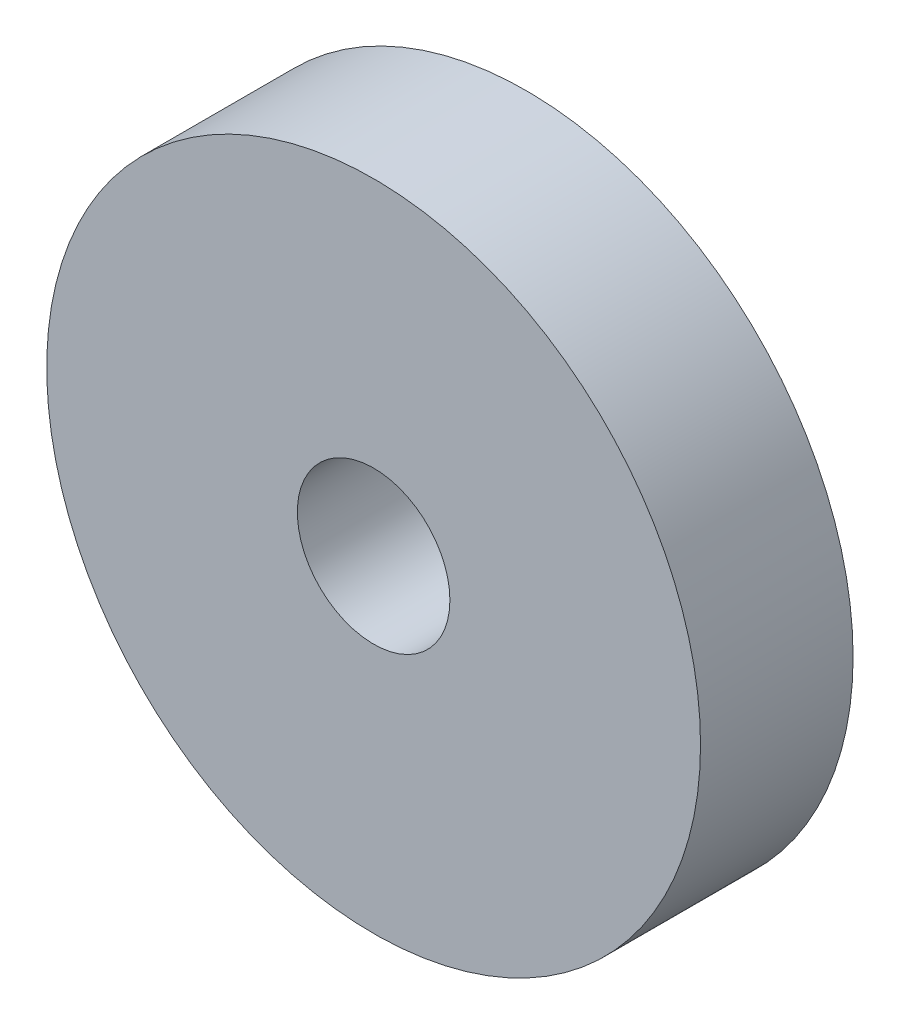
ISO-10303-21;
HEADER;
FILE_DESCRIPTION(('STEP AP214'),'2;1');
FILE_NAME('part.step','',(''),(''),'','','');
FILE_SCHEMA(('AUTOMOTIVE_DESIGN { 1 0 10303 214 1 1 1 1 }'));
ENDSEC;
DATA;
#1=APPLICATION_CONTEXT('core data for automotive mechanical design processes');
#2=APPLICATION_PROTOCOL_DEFINITION('international standard','automotive_design',2000,#1);
#3=PRODUCT_CONTEXT('',#1,'mechanical');
#4=PRODUCT('Part','Part','',(#3));
#5=PRODUCT_RELATED_PRODUCT_CATEGORY('part','',(#4));
#6=PRODUCT_DEFINITION_FORMATION('','',#4);
#7=PRODUCT_DEFINITION_CONTEXT('part definition',#1,'design');
#8=PRODUCT_DEFINITION('design','',#6,#7);
#9=PRODUCT_DEFINITION_SHAPE('','',#8);
#10=(LENGTH_UNIT() NAMED_UNIT(*) SI_UNIT(.MILLI.,.METRE.));
#11=(NAMED_UNIT(*) PLANE_ANGLE_UNIT() SI_UNIT($,.RADIAN.));
#12=(NAMED_UNIT(*) SI_UNIT($,.STERADIAN.) SOLID_ANGLE_UNIT());
#13=UNCERTAINTY_MEASURE_WITH_UNIT(LENGTH_MEASURE(1.E-05),#10,'distance_accuracy_value','');
#14=(GEOMETRIC_REPRESENTATION_CONTEXT(3) GLOBAL_UNCERTAINTY_ASSIGNED_CONTEXT((#13)) GLOBAL_UNIT_ASSIGNED_CONTEXT((#10,
#11,#12)) REPRESENTATION_CONTEXT('',''));
#15=CARTESIAN_POINT('',(0.,0.,0.));
#16=DIRECTION('',(0.,0.,1.));
#17=DIRECTION('',(1.,0.,0.));
#18=AXIS2_PLACEMENT_3D('',#15,#16,#17);
#19=CARTESIAN_POINT('',(0.,0.,1.778));
#20=DIRECTION('',(0.,0.,1.));
#21=DIRECTION('',(1.,0.,0.));
#22=AXIS2_PLACEMENT_3D('',#19,#20,#21);
#23=PLANE('',#22);
#24=CARTESIAN_POINT('',(0.,0.,1.778));
#25=DIRECTION('',(0.,0.,1.));
#26=DIRECTION('',(1.,0.,0.));
#27=AXIS2_PLACEMENT_3D('',#24,#25,#26);
#28=CIRCLE('',#27,3.81);
#29=CARTESIAN_POINT('',(3.81,0.,1.778));
#30=VERTEX_POINT('',#29);
#31=EDGE_CURVE('E10',#30,#30,#28,.T.);
#32=ORIENTED_EDGE('',*,*,#31,.T.);
#33=EDGE_LOOP('',(#32));
#34=FACE_BOUND('',#33,.T.);
#35=CARTESIAN_POINT('',(0.,0.,1.778));
#36=DIRECTION('',(0.,0.,1.));
#37=DIRECTION('',(1.,0.,0.));
#38=AXIS2_PLACEMENT_3D('',#35,#36,#37);
#39=CIRCLE('',#38,0.889000000000001);
#40=CARTESIAN_POINT('',(0.889000000000001,0.,1.778));
#41=VERTEX_POINT('',#40);
#42=EDGE_CURVE('E42',#41,#41,#39,.T.);
#43=ORIENTED_EDGE('',*,*,#42,.F.);
#44=EDGE_LOOP('',(#43));
#45=FACE_BOUND('',#44,.T.);
#46=ADVANCED_FACE('F31',(#34,#45),#23,.T.);
#47=CARTESIAN_POINT('',(0.,0.,0.));
#48=DIRECTION('',(0.,0.,1.));
#49=DIRECTION('',(1.,0.,0.));
#50=AXIS2_PLACEMENT_3D('',#47,#48,#49);
#51=PLANE('',#50);
#52=CARTESIAN_POINT('',(0.,0.,0.));
#53=DIRECTION('',(0.,0.,1.));
#54=DIRECTION('',(1.,0.,0.));
#55=AXIS2_PLACEMENT_3D('',#52,#53,#54);
#56=CIRCLE('',#55,3.81);
#57=CARTESIAN_POINT('',(3.81,0.,0.));
#58=VERTEX_POINT('',#57);
#59=EDGE_CURVE('E35',#58,#58,#56,.T.);
#60=ORIENTED_EDGE('',*,*,#59,.F.);
#61=EDGE_LOOP('',(#60));
#62=FACE_BOUND('',#61,.T.);
#63=CARTESIAN_POINT('',(0.,0.,0.));
#64=DIRECTION('',(0.,0.,1.));
#65=DIRECTION('',(1.,0.,0.));
#66=AXIS2_PLACEMENT_3D('',#63,#64,#65);
#67=CIRCLE('',#66,0.889000000000001);
#68=CARTESIAN_POINT('',(0.889000000000001,0.,0.));
#69=VERTEX_POINT('',#68);
#70=EDGE_CURVE('E44',#69,#69,#67,.T.);
#71=ORIENTED_EDGE('',*,*,#70,.T.);
#72=EDGE_LOOP('',(#71));
#73=FACE_BOUND('',#72,.T.);
#74=ADVANCED_FACE('F54',(#62,#73),#51,.F.);
#75=CARTESIAN_POINT('',(0.,0.,1.778));
#76=DIRECTION('',(0.,0.,-1.));
#77=DIRECTION('',(-1.,0.,0.));
#78=AXIS2_PLACEMENT_3D('',#75,#76,#77);
#79=CYLINDRICAL_SURFACE('',#78,3.81);
#80=ORIENTED_EDGE('',*,*,#31,.F.);
#81=EDGE_LOOP('',(#80));
#82=FACE_BOUND('',#81,.T.);
#83=ORIENTED_EDGE('',*,*,#59,.T.);
#84=EDGE_LOOP('',(#83));
#85=FACE_BOUND('',#84,.T.);
#86=ADVANCED_FACE('F33',(#82,#85),#79,.T.);
#87=CARTESIAN_POINT('',(0.,0.,1.778));
#88=DIRECTION('',(0.,0.,-1.));
#89=DIRECTION('',(-1.,0.,0.));
#90=AXIS2_PLACEMENT_3D('',#87,#88,#89);
#91=CYLINDRICAL_SURFACE('',#90,0.889000000000001);
#92=ORIENTED_EDGE('',*,*,#42,.T.);
#93=EDGE_LOOP('',(#92));
#94=FACE_BOUND('',#93,.T.);
#95=ORIENTED_EDGE('',*,*,#70,.F.);
#96=EDGE_LOOP('',(#95));
#97=FACE_BOUND('',#96,.T.);
#98=ADVANCED_FACE('F50',(#94,#97),#91,.F.);
#99=CLOSED_SHELL('',(#46,#74,#86,#98));
#100=MANIFOLD_SOLID_BREP('B2',#99);
#101=ADVANCED_BREP_SHAPE_REPRESENTATION('',(#18,#100),#14);
#102=SHAPE_DEFINITION_REPRESENTATION(#9,#101);
ENDSEC;
END-ISO-10303-21;
